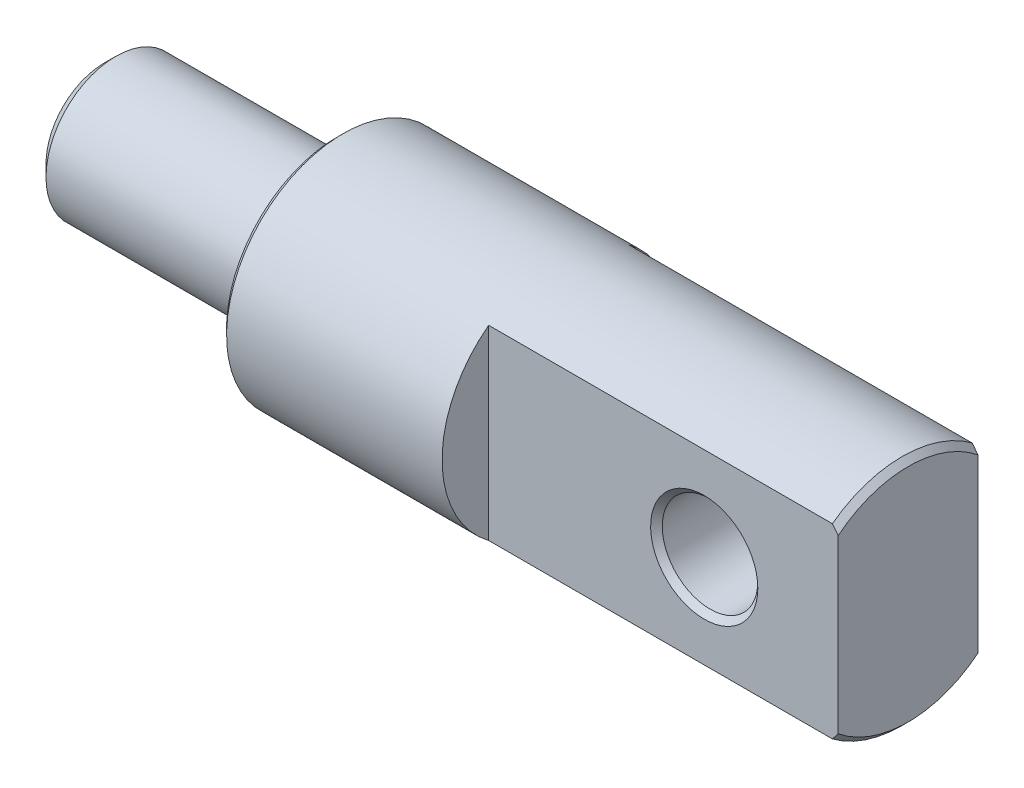
ISO-10303-21;
HEADER;
FILE_DESCRIPTION(('STEP AP214'),'2;1');
FILE_NAME('part.step','',(''),(''),'','','');
FILE_SCHEMA(('AUTOMOTIVE_DESIGN { 1 0 10303 214 1 1 1 1 }'));
ENDSEC;
DATA;
#1=APPLICATION_CONTEXT('core data for automotive mechanical design processes');
#2=APPLICATION_PROTOCOL_DEFINITION('international standard','automotive_design',2000,#1);
#3=PRODUCT_CONTEXT('',#1,'mechanical');
#4=PRODUCT('Part','Part','',(#3));
#5=PRODUCT_RELATED_PRODUCT_CATEGORY('part','',(#4));
#6=PRODUCT_DEFINITION_FORMATION('','',#4);
#7=PRODUCT_DEFINITION_CONTEXT('part definition',#1,'design');
#8=PRODUCT_DEFINITION('design','',#6,#7);
#9=PRODUCT_DEFINITION_SHAPE('','',#8);
#10=(LENGTH_UNIT() NAMED_UNIT(*) SI_UNIT(.MILLI.,.METRE.));
#11=(NAMED_UNIT(*) PLANE_ANGLE_UNIT() SI_UNIT($,.RADIAN.));
#12=(NAMED_UNIT(*) SI_UNIT($,.STERADIAN.) SOLID_ANGLE_UNIT());
#13=UNCERTAINTY_MEASURE_WITH_UNIT(LENGTH_MEASURE(1.E-05),#10,'distance_accuracy_value','');
#14=(GEOMETRIC_REPRESENTATION_CONTEXT(3) GLOBAL_UNCERTAINTY_ASSIGNED_CONTEXT((#13)) GLOBAL_UNIT_ASSIGNED_CONTEXT((#10,
#11,#12)) REPRESENTATION_CONTEXT('',''));
#15=CARTESIAN_POINT('',(0.,0.,0.));
#16=DIRECTION('',(0.,0.,1.));
#17=DIRECTION('',(1.,0.,0.));
#18=AXIS2_PLACEMENT_3D('',#15,#16,#17);
#19=CARTESIAN_POINT('',(-0.499999999999994,0.,0.));
#20=DIRECTION('',(-1.,0.,0.));
#21=DIRECTION('',(0.,0.,1.));
#22=AXIS2_PLACEMENT_3D('',#19,#20,#21);
#23=CONICAL_SURFACE('',#22,10.,0.785398163397447);
#24=CARTESIAN_POINT('',(-12.5039494142455,21.1701154891671,-6.));
#25=CARTESIAN_POINT('',(-12.091190365847,20.7410798294589,-6.));
#26=CARTESIAN_POINT('',(-11.6788968606787,20.3115950192424,-6.));
#27=CARTESIAN_POINT('',(-10.8554743710338,19.4515033713583,-6.));
#28=CARTESIAN_POINT('',(-10.4443453969857,19.0208965237089,-6.));
#29=CARTESIAN_POINT('',(-9.62336194211401,18.1582072404821,-6.));
#30=CARTESIAN_POINT('',(-9.2135079093668,17.7261243782643,-6.));
#31=CARTESIAN_POINT('',(-8.39553655712459,16.8603200291922,-6.));
#32=CARTESIAN_POINT('',(-7.98741923114935,16.4265985484637,-6.));
#33=CARTESIAN_POINT('',(-7.17633451033705,15.5603061278133,-6.));
#34=CARTESIAN_POINT('',(-6.77335128776228,15.127750017435,-6.));
#35=CARTESIAN_POINT('',(-5.97010411156479,14.2601209617599,-6.));
#36=CARTESIAN_POINT('',(-5.56984014626431,13.8250480272863,-6.));
#37=CARTESIAN_POINT('',(-4.77289483196968,12.9517347517868,-6.));
#38=CARTESIAN_POINT('',(-4.37621301722734,12.5134948362666,-6.));
#39=CARTESIAN_POINT('',(-3.58754545885852,11.6328148436562,-6.));
#40=CARTESIAN_POINT('',(-3.19555961370525,11.1903748577435,-6.));
#41=CARTESIAN_POINT('',(-2.52798578717093,10.4257658260493,-6.));
#42=CARTESIAN_POINT('',(-2.25082914669205,10.1049677540448,-6.));
#43=CARTESIAN_POINT('',(-1.70077429329717,9.45969683514604,-6.));
#44=CARTESIAN_POINT('',(-1.42787634977637,9.13522375800219,-6.));
#45=CARTESIAN_POINT('',(-0.886435619918574,8.48010750822695,-6.));
#46=CARTESIAN_POINT('',(-0.617919020967711,8.14944264449793,-6.));
#47=CARTESIAN_POINT('',(-0.0885405137306227,7.4820815089113,-6.));
#48=CARTESIAN_POINT('',(0.172322570913099,7.14538617689435,-6.));
#49=CARTESIAN_POINT('',(0.556645957484463,6.63297662670291,-6.));
#50=CARTESIAN_POINT('',(0.684083536426392,6.4602453788909,-6.));
#51=CARTESIAN_POINT('',(0.935695812977345,6.11242616941712,-6.));
#52=CARTESIAN_POINT('',(1.05987063360173,5.93733829698436,-6.));
#53=CARTESIAN_POINT('',(1.3043942970045,5.58427970421674,-6.));
#54=CARTESIAN_POINT('',(1.42473974081136,5.40630662340097,-6.));
#55=CARTESIAN_POINT('',(1.66062192522121,5.04719581841993,-6.));
#56=CARTESIAN_POINT('',(1.77615876899503,4.86605816227067,-6.));
#57=CARTESIAN_POINT('',(2.00087763108439,4.50083145164879,-6.));
#58=CARTESIAN_POINT('',(2.11008249541807,4.31675651859897,-6.));
#59=CARTESIAN_POINT('',(2.32121427590931,3.94442461780801,-6.));
#60=CARTESIAN_POINT('',(2.42314029636469,3.75616713910571,-6.));
#61=CARTESIAN_POINT('',(2.61774281634996,3.37523835560987,-6.));
#62=CARTESIAN_POINT('',(2.71043249905714,3.18257383873923,-6.));
#63=CARTESIAN_POINT('',(2.88441890461401,2.79220723693701,-6.));
#64=CARTESIAN_POINT('',(2.9657200378082,2.59450713734115,-6.));
#65=CARTESIAN_POINT('',(3.11560055003229,2.19008153634465,-6.));
#66=CARTESIAN_POINT('',(3.18391526658625,1.98325656825776,-6.));
#67=CARTESIAN_POINT('',(3.30263551502802,1.56447670305726,-6.));
#68=CARTESIAN_POINT('',(3.35304391038792,1.3525226319548,-6.));
#69=CARTESIAN_POINT('',(3.43252144617962,0.926164904619122,-6.));
#70=CARTESIAN_POINT('',(3.46174301381399,0.711790247191936,-6.));
#71=CARTESIAN_POINT('',(3.49724782214167,0.281135582464939,-6.));
#72=CARTESIAN_POINT('',(3.50353426941779,0.064855845754998,-6.));
#73=CARTESIAN_POINT('',(3.49264454748877,-0.367714626053586,-6.));
#74=CARTESIAN_POINT('',(3.47540156883901,-0.584003641484009,-6.));
#75=CARTESIAN_POINT('',(3.41871408384063,-1.01363081578645,-6.));
#76=CARTESIAN_POINT('',(3.37926493878841,-1.22696834857251,-6.));
#77=CARTESIAN_POINT('',(3.28051855064258,-1.65069513567977,-6.));
#78=CARTESIAN_POINT('',(3.22106654901841,-1.8610476458576,-6.));
#79=CARTESIAN_POINT('',(3.08571610576618,-2.27631462913761,-6.));
#80=CARTESIAN_POINT('',(3.00981681372029,-2.48122882043279,-6.));
#81=CARTESIAN_POINT('',(2.82936136375063,-2.92325359049391,-6.));
#82=CARTESIAN_POINT('',(2.72210071483705,-3.15924955537198,-6.));
#83=CARTESIAN_POINT('',(2.49327054486448,-3.62425908965807,-6.));
#84=CARTESIAN_POINT('',(2.37169298791231,-3.85326864602353,-6.));
#85=CARTESIAN_POINT('',(2.11739341373863,-4.30556788571122,-6.));
#86=CARTESIAN_POINT('',(1.98464952788855,-4.52884517213356,-6.));
#87=CARTESIAN_POINT('',(1.71077662824844,-4.97010111432998,-6.));
#88=CARTESIAN_POINT('',(1.56964922410078,-5.18808077599959,-6.));
#89=CARTESIAN_POINT('',(1.27927805801862,-5.62196791451213,-6.));
#90=CARTESIAN_POINT('',(1.12996300177842,-5.83782745434849,-6.));
#91=CARTESIAN_POINT('',(0.826047803473616,-6.26579050362456,-6.));
#92=CARTESIAN_POINT('',(0.671447474968389,-6.47789388016227,-6.));
#93=CARTESIAN_POINT('',(0.358225638411608,-6.89867699809957,-6.));
#94=CARTESIAN_POINT('',(0.199609570985605,-7.10736080044577,-6.));
#95=CARTESIAN_POINT('',(-0.12103675251668,-7.52207550413621,-6.));
#96=CARTESIAN_POINT('',(-0.283066938100282,-7.72810646011362,-6.));
#97=CARTESIAN_POINT('',(-0.687168412794741,-8.23478049054392,-6.));
#98=CARTESIAN_POINT('',(-0.93087582518826,-8.53411770246222,-6.));
#99=CARTESIAN_POINT('',(-1.4229207494858,-9.12896889507986,-6.));
#100=CARTESIAN_POINT('',(-1.67125844952637,-9.4244827195984,-6.));
#101=CARTESIAN_POINT('',(-2.17157845392902,-10.0124717176516,-6.));
#102=CARTESIAN_POINT('',(-2.42356123746384,-10.3049464828347,-6.));
#103=CARTESIAN_POINT('',(-2.93040067395281,-10.8873979080798,-6.));
#104=CARTESIAN_POINT('',(-3.18525736345251,-11.1773745362917,-6.));
#105=CARTESIAN_POINT('',(-3.69757418996066,-11.7555923289856,-6.));
#106=CARTESIAN_POINT('',(-3.9550369058519,-12.0438312062426,-6.));
#107=CARTESIAN_POINT('',(-4.47187020755025,-12.6185943396549,-6.));
#108=CARTESIAN_POINT('',(-4.73124080308913,-12.9051185870507,-6.));
#109=CARTESIAN_POINT('',(-5.5116633750808,-13.7624968960908,-6.));
#110=CARTESIAN_POINT('',(-6.03507086463796,-14.3312067610223,-6.));
#111=CARTESIAN_POINT('',(-7.05088012078864,-15.4262879079344,-6.));
#112=CARTESIAN_POINT('',(-7.54299267901504,-15.9529281874446,-6.));
#113=CARTESIAN_POINT('',(-8.53014443431241,-17.0034816136318,-6.));
#114=CARTESIAN_POINT('',(-9.02518370281447,-17.5273946931553,-6.));
#115=CARTESIAN_POINT('',(-10.0165236482941,-18.572072034514,-6.));
#116=CARTESIAN_POINT('',(-10.5128199444807,-19.0928404576516,-6.));
#117=CARTESIAN_POINT('',(-11.5071723775412,-20.1326585214098,-6.));
#118=CARTESIAN_POINT('',(-12.0052284494463,-20.6517082241409,-6.));
#119=CARTESIAN_POINT('',(-12.5039494142455,-21.1701154891671,-6.));
#120=B_SPLINE_CURVE_WITH_KNOTS('',3,(#24,#25,#26,#27,#28,#29,#30,#31,#32,#33,#34,#35,#36,#37,
#38,#39,#40,#41,#42,#43,#44,#45,#46,#47,#48,#49,#50,#51,#52,#53,#54,#55,#56,#57,#58,#59,#60,#61,
#62,#63,#64,#65,#66,#67,#68,#69,#70,#71,#72,#73,#74,#75,#76,#77,#78,#79,#80,#81,#82,#83,#84,#85,
#86,#87,#88,#89,#90,#91,#92,#93,#94,#95,#96,#97,#98,#99,#100,#101,#102,#103,#104,#105,#106,#107,
#108,#109,#110,#111,#112,#113,#114,#115,#116,#117,#118,#119),.UNSPECIFIED.,.F.,.F.,(4,2,2,2,2,2,
2,2,2,2,2,2,2,2,2,2,2,2,2,2,2,2,2,2,2,2,2,2,2,2,2,2,2,2,2,2,2,2,2,2,2,2,2,2,2,2,2,4),(0.,
1.78605103355112,3.57211801106311,5.35875436760017,7.14538405174456,8.91893159898234,
10.6924715249716,12.4657774370266,14.2390449407946,15.5108448631283,16.7827249130763,
18.0605256932281,19.3381290333558,19.9820620585823,20.6259707707449,21.2704359205352,
21.9148872358783,22.5568465039908,23.1988846331175,23.8399928343649,24.4808520687409,
25.1336276587972,25.7862988138318,26.434226473307,27.0820635418764,27.7317439114176,
28.3815600447627,29.0365239420978,29.6915217128501,30.4685559906934,31.2460285053799,
32.025060781223,32.8039439626689,33.5912542660151,34.3785923708414,35.1649155160774,
35.9512224416591,37.1091567026039,38.2671381153823,39.4252731621318,40.5834229527557,
41.7428600320195,42.9023030294748,45.22098724893,47.3833171712582,49.5457000884201,
51.703840220229,53.8619014915945),.UNSPECIFIED.);
#121=CARTESIAN_POINT('',(-0.499999999999993,8.,-6.));
#122=VERTEX_POINT('',#121);
#123=CARTESIAN_POINT('',(0.,7.36545993132813,-6.));
#124=VERTEX_POINT('',#123);
#125=EDGE_CURVE('E87',#122,#124,#120,.T.);
#126=ORIENTED_EDGE('',*,*,#125,.F.);
#127=CARTESIAN_POINT('',(-0.499999999999994,0.,0.));
#128=DIRECTION('',(-1.,0.,0.));
#129=DIRECTION('',(0.,0.,1.));
#130=AXIS2_PLACEMENT_3D('',#127,#128,#129);
#131=CIRCLE('',#130,10.);
#132=CARTESIAN_POINT('',(-0.499999999999993,8.,6.));
#133=VERTEX_POINT('',#132);
#134=EDGE_CURVE('E110',#133,#122,#131,.T.);
#135=ORIENTED_EDGE('',*,*,#134,.F.);
#136=CARTESIAN_POINT('',(-12.5039494142455,-21.1701154891671,6.));
#137=CARTESIAN_POINT('',(-12.091190365847,-20.7410798294589,6.));
#138=CARTESIAN_POINT('',(-11.6788968606787,-20.3115950192424,6.));
#139=CARTESIAN_POINT('',(-10.8554743710338,-19.4515033713583,6.));
#140=CARTESIAN_POINT('',(-10.4443453969857,-19.0208965237089,6.));
#141=CARTESIAN_POINT('',(-9.62336194211401,-18.1582072404821,6.));
#142=CARTESIAN_POINT('',(-9.21350790936681,-17.7261243782643,6.));
#143=CARTESIAN_POINT('',(-8.39553655712459,-16.8603200291922,6.));
#144=CARTESIAN_POINT('',(-7.98741923114935,-16.4265985484637,6.));
#145=CARTESIAN_POINT('',(-7.17633451033705,-15.5603061278133,6.));
#146=CARTESIAN_POINT('',(-6.77335128776228,-15.127750017435,6.));
#147=CARTESIAN_POINT('',(-5.97010411156478,-14.2601209617599,6.));
#148=CARTESIAN_POINT('',(-5.56984014626431,-13.8250480272863,6.));
#149=CARTESIAN_POINT('',(-4.77289483196968,-12.9517347517868,6.));
#150=CARTESIAN_POINT('',(-4.37621301722734,-12.5134948362666,6.));
#151=CARTESIAN_POINT('',(-3.58754545885852,-11.6328148436562,6.));
#152=CARTESIAN_POINT('',(-3.19555961370525,-11.1903748577435,6.));
#153=CARTESIAN_POINT('',(-2.52798578717094,-10.4257658260493,6.));
#154=CARTESIAN_POINT('',(-2.25082914669206,-10.1049677540448,6.));
#155=CARTESIAN_POINT('',(-1.70077429329717,-9.45969683514605,6.));
#156=CARTESIAN_POINT('',(-1.42787634977637,-9.13522375800219,6.));
#157=CARTESIAN_POINT('',(-0.886435619918575,-8.48010750822695,6.));
#158=CARTESIAN_POINT('',(-0.617919020967711,-8.14944264449793,6.));
#159=CARTESIAN_POINT('',(-0.0885405137306242,-7.4820815089113,6.));
#160=CARTESIAN_POINT('',(0.172322570913097,-7.14538617689435,6.));
#161=CARTESIAN_POINT('',(0.556645957484462,-6.63297662670291,6.));
#162=CARTESIAN_POINT('',(0.684083536426392,-6.4602453788909,6.));
#163=CARTESIAN_POINT('',(0.935695812977346,-6.11242616941712,6.));
#164=CARTESIAN_POINT('',(1.05987063360173,-5.93733829698436,6.));
#165=CARTESIAN_POINT('',(1.3043942970045,-5.58427970421674,6.));
#166=CARTESIAN_POINT('',(1.42473974081136,-5.40630662340097,6.));
#167=CARTESIAN_POINT('',(1.66062192522121,-5.04719581841993,6.));
#168=CARTESIAN_POINT('',(1.77615876899503,-4.86605816227067,6.));
#169=CARTESIAN_POINT('',(2.00087763108439,-4.50083145164879,6.));
#170=CARTESIAN_POINT('',(2.11008249541807,-4.31675651859897,6.));
#171=CARTESIAN_POINT('',(2.32121427590931,-3.94442461780801,6.));
#172=CARTESIAN_POINT('',(2.42314029636469,-3.75616713910571,6.));
#173=CARTESIAN_POINT('',(2.61774281634997,-3.37523835560987,6.));
#174=CARTESIAN_POINT('',(2.71043249905714,-3.18257383873923,6.));
#175=CARTESIAN_POINT('',(2.88441890461401,-2.792207236937,6.));
#176=CARTESIAN_POINT('',(2.9657200378082,-2.59450713734115,6.));
#177=CARTESIAN_POINT('',(3.11560055003229,-2.19008153634465,6.));
#178=CARTESIAN_POINT('',(3.18391526658625,-1.98325656825776,6.));
#179=CARTESIAN_POINT('',(3.30263551502802,-1.56447670305726,6.));
#180=CARTESIAN_POINT('',(3.35304391038792,-1.3525226319548,6.));
#181=CARTESIAN_POINT('',(3.43252144617962,-0.926164904619119,6.));
#182=CARTESIAN_POINT('',(3.46174301381399,-0.711790247191932,6.));
#183=CARTESIAN_POINT('',(3.49724782214167,-0.281135582464935,6.));
#184=CARTESIAN_POINT('',(3.50353426941779,-0.0648558457549947,6.));
#185=CARTESIAN_POINT('',(3.49264454748876,0.36771462605359,6.));
#186=CARTESIAN_POINT('',(3.47540156883901,0.584003641484014,6.));
#187=CARTESIAN_POINT('',(3.41871408384063,1.01363081578645,6.));
#188=CARTESIAN_POINT('',(3.37926493878841,1.22696834857251,6.));
#189=CARTESIAN_POINT('',(3.28051855064257,1.65069513567978,6.));
#190=CARTESIAN_POINT('',(3.22106654901841,1.86104764585761,6.));
#191=CARTESIAN_POINT('',(3.08571610576618,2.27631462913762,6.));
#192=CARTESIAN_POINT('',(3.00981681372029,2.4812288204328,6.));
#193=CARTESIAN_POINT('',(2.82936136375063,2.92325359049391,6.));
#194=CARTESIAN_POINT('',(2.72210071483704,3.15924955537198,6.));
#195=CARTESIAN_POINT('',(2.49327054486448,3.62425908965807,6.));
#196=CARTESIAN_POINT('',(2.37169298791231,3.85326864602353,6.));
#197=CARTESIAN_POINT('',(2.11739341373863,4.30556788571122,6.));
#198=CARTESIAN_POINT('',(1.98464952788854,4.52884517213357,6.));
#199=CARTESIAN_POINT('',(1.71077662824844,4.97010111432999,6.));
#200=CARTESIAN_POINT('',(1.56964922410077,5.1880807759996,6.));
#201=CARTESIAN_POINT('',(1.27927805801862,5.62196791451214,6.));
#202=CARTESIAN_POINT('',(1.12996300177842,5.83782745434849,6.));
#203=CARTESIAN_POINT('',(0.826047803473614,6.26579050362456,6.));
#204=CARTESIAN_POINT('',(0.671447474968386,6.47789388016228,6.));
#205=CARTESIAN_POINT('',(0.358225638411602,6.89867699809958,6.));
#206=CARTESIAN_POINT('',(0.199609570985599,7.10736080044577,6.));
#207=CARTESIAN_POINT('',(-0.121036752516689,7.52207550413622,6.));
#208=CARTESIAN_POINT('',(-0.283066938100291,7.72810646011363,6.));
#209=CARTESIAN_POINT('',(-0.687168412794751,8.23478049054393,6.));
#210=CARTESIAN_POINT('',(-0.930875825188269,8.53411770246223,6.));
#211=CARTESIAN_POINT('',(-1.42292074948581,9.12896889507987,6.));
#212=CARTESIAN_POINT('',(-1.67125844952638,9.42448271959841,6.));
#213=CARTESIAN_POINT('',(-2.17157845392903,10.0124717176516,6.));
#214=CARTESIAN_POINT('',(-2.42356123746385,10.3049464828347,6.));
#215=CARTESIAN_POINT('',(-2.93040067395282,10.8873979080798,6.));
#216=CARTESIAN_POINT('',(-3.18525736345251,11.1773745362918,6.));
#217=CARTESIAN_POINT('',(-3.69757418996066,11.7555923289856,6.));
#218=CARTESIAN_POINT('',(-3.9550369058519,12.0438312062426,6.));
#219=CARTESIAN_POINT('',(-4.47187020755026,12.6185943396549,6.));
#220=CARTESIAN_POINT('',(-4.73124080308914,12.9051185870507,6.));
#221=CARTESIAN_POINT('',(-5.51166337508081,13.7624968960908,6.));
#222=CARTESIAN_POINT('',(-6.03507086463797,14.3312067610223,6.));
#223=CARTESIAN_POINT('',(-7.05088012078864,15.4262879079344,6.));
#224=CARTESIAN_POINT('',(-7.54299267901504,15.9529281874446,6.));
#225=CARTESIAN_POINT('',(-8.53014443431242,17.0034816136318,6.));
#226=CARTESIAN_POINT('',(-9.02518370281448,17.5273946931553,6.));
#227=CARTESIAN_POINT('',(-10.0165236482941,18.5720720345141,6.));
#228=CARTESIAN_POINT('',(-10.5128199444807,19.0928404576516,6.));
#229=CARTESIAN_POINT('',(-11.5071723775412,20.1326585214098,6.));
#230=CARTESIAN_POINT('',(-12.0052284494463,20.6517082241409,6.));
#231=CARTESIAN_POINT('',(-12.5039494142455,21.1701154891671,6.));
#232=B_SPLINE_CURVE_WITH_KNOTS('',3,(#136,#137,#138,#139,#140,#141,#142,#143,#144,#145,#146,
#147,#148,#149,#150,#151,#152,#153,#154,#155,#156,#157,#158,#159,#160,#161,#162,#163,#164,#165,
#166,#167,#168,#169,#170,#171,#172,#173,#174,#175,#176,#177,#178,#179,#180,#181,#182,#183,#184,
#185,#186,#187,#188,#189,#190,#191,#192,#193,#194,#195,#196,#197,#198,#199,#200,#201,#202,#203,
#204,#205,#206,#207,#208,#209,#210,#211,#212,#213,#214,#215,#216,#217,#218,#219,#220,#221,#222,
#223,#224,#225,#226,#227,#228,#229,#230,#231),.UNSPECIFIED.,.F.,.F.,(4,2,2,2,2,2,2,2,2,2,2,2,2,
2,2,2,2,2,2,2,2,2,2,2,2,2,2,2,2,2,2,2,2,2,2,2,2,2,2,2,2,2,2,2,2,2,2,4),(0.,1.78605103355111,
3.57211801106311,5.35875436760017,7.14538405174457,8.91893159898235,10.6924715249717,
12.4657774370266,14.2390449407946,15.5108448631283,16.7827249130763,18.0605256932281,
19.3381290333558,19.9820620585823,20.6259707707449,21.2704359205352,21.9148872358784,
22.5568465039908,23.1988846331175,23.8399928343649,24.4808520687409,25.1336276587972,
25.7862988138318,26.434226473307,27.0820635418764,27.7317439114176,28.3815600447627,
29.0365239420978,29.6915217128501,30.4685559906934,31.2460285053799,32.025060781223,
32.8039439626689,33.5912542660151,34.3785923708414,35.1649155160774,35.9512224416591,
37.1091567026039,38.2671381153823,39.4252731621318,40.5834229527557,41.7428600320195,
42.9023030294748,45.22098724893,47.3833171712582,49.5457000884201,51.703840220229,
53.8619014915945),.UNSPECIFIED.);
#233=CARTESIAN_POINT('',(0.,7.36545993132813,6.));
#234=VERTEX_POINT('',#233);
#235=EDGE_CURVE('E105',#234,#133,#232,.T.);
#236=ORIENTED_EDGE('',*,*,#235,.F.);
#237=CARTESIAN_POINT('',(0.,0.,0.));
#238=DIRECTION('',(-1.,0.,0.));
#239=DIRECTION('',(0.,0.,1.));
#240=AXIS2_PLACEMENT_3D('',#237,#238,#239);
#241=CIRCLE('',#240,9.50000000000001);
#242=EDGE_CURVE('E57',#124,#234,#241,.F.);
#243=ORIENTED_EDGE('',*,*,#242,.F.);
#244=EDGE_LOOP('',(#126,#135,#236,#243));
#245=FACE_BOUND('',#244,.T.);
#246=ADVANCED_FACE('F35',(#245),#23,.T.);
#247=CARTESIAN_POINT('',(0.,10.,0.));
#248=DIRECTION('',(-1.,0.,0.));
#249=DIRECTION('',(0.,0.,1.));
#250=AXIS2_PLACEMENT_3D('',#247,#248,#249);
#251=PLANE('',#250);
#252=CARTESIAN_POINT('',(0.,-7.36545993132813,6.));
#253=VERTEX_POINT('',#252);
#254=CARTESIAN_POINT('',(0.,-7.36545993132813,-6.));
#255=VERTEX_POINT('',#254);
#256=EDGE_CURVE('E101',#253,#255,#241,.F.);
#257=ORIENTED_EDGE('',*,*,#256,.T.);
#258=DIRECTION('',(0.,-1.,0.));
#259=VECTOR('',#258,1.);
#260=CARTESIAN_POINT('',(0.,15.,-6.));
#261=LINE('',#260,#259);
#262=EDGE_CURVE('E50',#124,#255,#261,.T.);
#263=ORIENTED_EDGE('',*,*,#262,.F.);
#264=ORIENTED_EDGE('',*,*,#242,.T.);
#265=DIRECTION('',(0.,1.,0.));
#266=VECTOR('',#265,1.);
#267=CARTESIAN_POINT('',(0.,15.,6.));
#268=LINE('',#267,#266);
#269=EDGE_CURVE('E310',#253,#234,#268,.T.);
#270=ORIENTED_EDGE('',*,*,#269,.F.);
#271=EDGE_LOOP('',(#257,#263,#264,#270));
#272=FACE_BOUND('',#271,.T.);
#273=ADVANCED_FACE('F99',(#272),#251,.F.);
#274=CARTESIAN_POINT('',(0.,0.,0.));
#275=DIRECTION('',(-1.,0.,0.));
#276=DIRECTION('',(0.,0.,1.));
#277=AXIS2_PLACEMENT_3D('',#274,#275,#276);
#278=CYLINDRICAL_SURFACE('',#277,10.);
#279=ORIENTED_EDGE('',*,*,#134,.T.);
#280=DIRECTION('',(-1.,0.,0.));
#281=VECTOR('',#280,1.);
#282=CARTESIAN_POINT('',(0.,8.,-6.));
#283=LINE('',#282,#281);
#284=CARTESIAN_POINT('',(-30.,8.,-6.));
#285=VERTEX_POINT('',#284);
#286=EDGE_CURVE('E91',#122,#285,#283,.T.);
#287=ORIENTED_EDGE('',*,*,#286,.T.);
#288=CARTESIAN_POINT('',(-30.,0.,0.));
#289=DIRECTION('',(1.,0.,0.));
#290=DIRECTION('',(0.,0.,-1.));
#291=AXIS2_PLACEMENT_3D('',#288,#289,#290);
#292=CIRCLE('',#291,10.);
#293=CARTESIAN_POINT('',(-30.,-8.,-6.));
#294=VERTEX_POINT('',#293);
#295=EDGE_CURVE('E95',#294,#285,#292,.T.);
#296=ORIENTED_EDGE('',*,*,#295,.F.);
#297=DIRECTION('',(-1.,0.,0.));
#298=VECTOR('',#297,1.);
#299=CARTESIAN_POINT('',(0.,-8.,-6.));
#300=LINE('',#299,#298);
#301=CARTESIAN_POINT('',(-0.499999999999993,-8.,-6.));
#302=VERTEX_POINT('',#301);
#303=EDGE_CURVE('E336',#294,#302,#300,.F.);
#304=ORIENTED_EDGE('',*,*,#303,.T.);
#305=CARTESIAN_POINT('',(-0.499999999999993,-8.,6.));
#306=VERTEX_POINT('',#305);
#307=EDGE_CURVE('E316',#302,#306,#131,.T.);
#308=ORIENTED_EDGE('',*,*,#307,.T.);
#309=DIRECTION('',(-1.,0.,0.));
#310=VECTOR('',#309,1.);
#311=CARTESIAN_POINT('',(0.,-8.,6.));
#312=LINE('',#311,#310);
#313=CARTESIAN_POINT('',(-30.,-8.,6.));
#314=VERTEX_POINT('',#313);
#315=EDGE_CURVE('E312',#306,#314,#312,.T.);
#316=ORIENTED_EDGE('',*,*,#315,.T.);
#317=CARTESIAN_POINT('',(-30.,0.,0.));
#318=DIRECTION('',(1.,0.,0.));
#319=DIRECTION('',(0.,0.,-1.));
#320=AXIS2_PLACEMENT_3D('',#317,#318,#319);
#321=CIRCLE('',#320,10.);
#322=CARTESIAN_POINT('',(-30.,8.,6.));
#323=VERTEX_POINT('',#322);
#324=EDGE_CURVE('E126',#323,#314,#321,.T.);
#325=ORIENTED_EDGE('',*,*,#324,.F.);
#326=DIRECTION('',(-1.,0.,0.));
#327=VECTOR('',#326,1.);
#328=CARTESIAN_POINT('',(0.,8.,6.));
#329=LINE('',#328,#327);
#330=EDGE_CURVE('E331',#323,#133,#329,.F.);
#331=ORIENTED_EDGE('',*,*,#330,.T.);
#332=EDGE_LOOP('',(#279,#287,#296,#304,#308,#316,#325,#331));
#333=FACE_BOUND('',#332,.T.);
#334=CARTESIAN_POINT('',(-48.5,0.,0.));
#335=DIRECTION('',(1.,0.,0.));
#336=DIRECTION('',(0.,0.,-1.));
#337=AXIS2_PLACEMENT_3D('',#334,#335,#336);
#338=CIRCLE('',#337,10.);
#339=CARTESIAN_POINT('',(-48.5,0.,-10.));
#340=VERTEX_POINT('',#339);
#341=EDGE_CURVE('E106',#340,#340,#338,.T.);
#342=ORIENTED_EDGE('',*,*,#341,.T.);
#343=EDGE_LOOP('',(#342));
#344=FACE_BOUND('',#343,.T.);
#345=ADVANCED_FACE('F160',(#333,#344),#278,.T.);
#346=CARTESIAN_POINT('',(-49.,4.99999999999999,0.));
#347=DIRECTION('',(1.,0.,0.));
#348=DIRECTION('',(0.,0.,-1.));
#349=AXIS2_PLACEMENT_3D('',#346,#347,#348);
#350=PLANE('',#349);
#351=CARTESIAN_POINT('',(-49.,0.,0.));
#352=DIRECTION('',(1.,0.,0.));
#353=DIRECTION('',(0.,0.,-1.));
#354=AXIS2_PLACEMENT_3D('',#351,#352,#353);
#355=CIRCLE('',#354,9.5);
#356=CARTESIAN_POINT('',(-49.,0.,-9.5));
#357=VERTEX_POINT('',#356);
#358=EDGE_CURVE('E317',#357,#357,#355,.F.);
#359=ORIENTED_EDGE('',*,*,#358,.T.);
#360=EDGE_LOOP('',(#359));
#361=FACE_BOUND('',#360,.T.);
#362=CARTESIAN_POINT('',(-49.,0.,0.));
#363=DIRECTION('',(-1.,0.,0.));
#364=DIRECTION('',(0.,0.,1.));
#365=AXIS2_PLACEMENT_3D('',#362,#363,#364);
#366=CIRCLE('',#365,4.99999999999999);
#367=CARTESIAN_POINT('',(-49.,0.,4.99999999999999));
#368=VERTEX_POINT('',#367);
#369=EDGE_CURVE('E319',#368,#368,#366,.T.);
#370=ORIENTED_EDGE('',*,*,#369,.F.);
#371=EDGE_LOOP('',(#370));
#372=FACE_BOUND('',#371,.T.);
#373=ADVANCED_FACE('F156',(#361,#372),#350,.F.);
#374=CARTESIAN_POINT('',(0.,0.,0.));
#375=DIRECTION('',(-1.,0.,0.));
#376=DIRECTION('',(0.,0.,1.));
#377=AXIS2_PLACEMENT_3D('',#374,#375,#376);
#378=CYLINDRICAL_SURFACE('',#377,4.99999999999999);
#379=CARTESIAN_POINT('',(-50.,0.,0.));
#380=DIRECTION('',(-1.,0.,0.));
#381=DIRECTION('',(0.,0.,1.));
#382=AXIS2_PLACEMENT_3D('',#379,#380,#381);
#383=CIRCLE('',#382,4.99999999999999);
#384=CARTESIAN_POINT('',(-50.,0.,4.99999999999999));
#385=VERTEX_POINT('',#384);
#386=EDGE_CURVE('E324',#385,#385,#383,.T.);
#387=ORIENTED_EDGE('',*,*,#386,.F.);
#388=EDGE_LOOP('',(#387));
#389=FACE_BOUND('',#388,.T.);
#390=ORIENTED_EDGE('',*,*,#369,.T.);
#391=EDGE_LOOP('',(#390));
#392=FACE_BOUND('',#391,.T.);
#393=ADVANCED_FACE('F152',(#389,#392),#378,.T.);
#394=CARTESIAN_POINT('',(-50.,6.,0.));
#395=DIRECTION('',(-1.,0.,0.));
#396=DIRECTION('',(0.,0.,1.));
#397=AXIS2_PLACEMENT_3D('',#394,#395,#396);
#398=PLANE('',#397);
#399=CARTESIAN_POINT('',(-50.,0.,0.));
#400=DIRECTION('',(-1.,0.,0.));
#401=DIRECTION('',(0.,0.,1.));
#402=AXIS2_PLACEMENT_3D('',#399,#400,#401);
#403=CIRCLE('',#402,6.);
#404=CARTESIAN_POINT('',(-50.,0.,6.));
#405=VERTEX_POINT('',#404);
#406=EDGE_CURVE('E327',#405,#405,#403,.T.);
#407=ORIENTED_EDGE('',*,*,#406,.F.);
#408=EDGE_LOOP('',(#407));
#409=FACE_BOUND('',#408,.T.);
#410=ORIENTED_EDGE('',*,*,#386,.T.);
#411=EDGE_LOOP('',(#410));
#412=FACE_BOUND('',#411,.T.);
#413=ADVANCED_FACE('F148',(#409,#412),#398,.F.);
#414=CARTESIAN_POINT('',(0.,0.,0.));
#415=DIRECTION('',(-1.,0.,0.));
#416=DIRECTION('',(0.,0.,1.));
#417=AXIS2_PLACEMENT_3D('',#414,#415,#416);
#418=CYLINDRICAL_SURFACE('',#417,6.);
#419=CARTESIAN_POINT('',(-68.,0.,0.));
#420=DIRECTION('',(1.,0.,0.));
#421=DIRECTION('',(0.,0.,-1.));
#422=AXIS2_PLACEMENT_3D('',#419,#420,#421);
#423=CIRCLE('',#422,6.);
#424=CARTESIAN_POINT('',(-68.,0.,-6.));
#425=VERTEX_POINT('',#424);
#426=EDGE_CURVE('E116',#425,#425,#423,.T.);
#427=ORIENTED_EDGE('',*,*,#426,.T.);
#428=EDGE_LOOP('',(#427));
#429=FACE_BOUND('',#428,.T.);
#430=ORIENTED_EDGE('',*,*,#406,.T.);
#431=EDGE_LOOP('',(#430));
#432=FACE_BOUND('',#431,.T.);
#433=ADVANCED_FACE('F144',(#429,#432),#418,.T.);
#434=CARTESIAN_POINT('',(-69.,6.,0.));
#435=DIRECTION('',(1.,0.,0.));
#436=DIRECTION('',(0.,0.,-1.));
#437=AXIS2_PLACEMENT_3D('',#434,#435,#436);
#438=PLANE('',#437);
#439=CARTESIAN_POINT('',(-69.,0.,0.));
#440=DIRECTION('',(1.,0.,0.));
#441=DIRECTION('',(0.,0.,-1.));
#442=AXIS2_PLACEMENT_3D('',#439,#440,#441);
#443=CIRCLE('',#442,5.);
#444=CARTESIAN_POINT('',(-69.,0.,-5.));
#445=VERTEX_POINT('',#444);
#446=EDGE_CURVE('E108',#445,#445,#443,.F.);
#447=ORIENTED_EDGE('',*,*,#446,.T.);
#448=EDGE_LOOP('',(#447));
#449=FACE_BOUND('',#448,.T.);
#450=ADVANCED_FACE('F140',(#449),#438,.F.);
#451=CARTESIAN_POINT('',(-49.,0.,0.));
#452=DIRECTION('',(1.,0.,0.));
#453=DIRECTION('',(0.,0.,-1.));
#454=AXIS2_PLACEMENT_3D('',#451,#452,#453);
#455=CONICAL_SURFACE('',#454,9.5,0.785398163397447);
#456=ORIENTED_EDGE('',*,*,#341,.F.);
#457=EDGE_LOOP('',(#456));
#458=FACE_BOUND('',#457,.T.);
#459=ORIENTED_EDGE('',*,*,#358,.F.);
#460=EDGE_LOOP('',(#459));
#461=FACE_BOUND('',#460,.T.);
#462=ADVANCED_FACE('F143',(#458,#461),#455,.T.);
#463=EDGE_CURVE('E96',#255,#302,#120,.T.);
#464=ORIENTED_EDGE('',*,*,#463,.F.);
#465=ORIENTED_EDGE('',*,*,#256,.F.);
#466=EDGE_CURVE('E125',#306,#253,#232,.T.);
#467=ORIENTED_EDGE('',*,*,#466,.F.);
#468=ORIENTED_EDGE('',*,*,#307,.F.);
#469=EDGE_LOOP('',(#464,#465,#467,#468));
#470=FACE_BOUND('',#469,.T.);
#471=ADVANCED_FACE('F127',(#470),#23,.T.);
#472=CARTESIAN_POINT('',(-69.,0.,0.));
#473=DIRECTION('',(1.,0.,0.));
#474=DIRECTION('',(0.,0.,-1.));
#475=AXIS2_PLACEMENT_3D('',#472,#473,#474);
#476=CONICAL_SURFACE('',#475,5.,0.785398163397441);
#477=ORIENTED_EDGE('',*,*,#426,.F.);
#478=EDGE_LOOP('',(#477));
#479=FACE_BOUND('',#478,.T.);
#480=ORIENTED_EDGE('',*,*,#446,.F.);
#481=EDGE_LOOP('',(#480));
#482=FACE_BOUND('',#481,.T.);
#483=ADVANCED_FACE('F171',(#479,#482),#476,.T.);
#484=CARTESIAN_POINT('',(-30.,0.,0.));
#485=DIRECTION('',(1.,0.,0.));
#486=DIRECTION('',(0.,0.,-1.));
#487=AXIS2_PLACEMENT_3D('',#484,#485,#486);
#488=PLANE('',#487);
#489=ORIENTED_EDGE('',*,*,#324,.T.);
#490=DIRECTION('',(0.,1.,0.));
#491=VECTOR('',#490,1.);
#492=CARTESIAN_POINT('',(-30.,15.,6.));
#493=LINE('',#492,#491);
#494=EDGE_CURVE('E314',#314,#323,#493,.T.);
#495=ORIENTED_EDGE('',*,*,#494,.T.);
#496=EDGE_LOOP('',(#489,#495));
#497=FACE_BOUND('',#496,.T.);
#498=ADVANCED_FACE('F137',(#497),#488,.T.);
#499=CARTESIAN_POINT('',(-30.,15.,6.));
#500=DIRECTION('',(0.,0.,-1.));
#501=DIRECTION('',(0.,1.,0.));
#502=AXIS2_PLACEMENT_3D('',#499,#500,#501);
#503=PLANE('',#502);
#504=CARTESIAN_POINT('',(-11.5,0.,6.));
#505=DIRECTION('',(0.,0.,-1.));
#506=DIRECTION('',(0.,1.,0.));
#507=AXIS2_PLACEMENT_3D('',#504,#505,#506);
#508=CIRCLE('',#507,4.6);
#509=CARTESIAN_POINT('',(-11.5,4.6,6.));
#510=VERTEX_POINT('',#509);
#511=EDGE_CURVE('E12',#510,#510,#508,.T.);
#512=ORIENTED_EDGE('',*,*,#511,.T.);
#513=EDGE_LOOP('',(#512));
#514=FACE_BOUND('',#513,.T.);
#515=ORIENTED_EDGE('',*,*,#466,.T.);
#516=ORIENTED_EDGE('',*,*,#269,.T.);
#517=ORIENTED_EDGE('',*,*,#235,.T.);
#518=ORIENTED_EDGE('',*,*,#330,.F.);
#519=ORIENTED_EDGE('',*,*,#494,.F.);
#520=ORIENTED_EDGE('',*,*,#315,.F.);
#521=EDGE_LOOP('',(#515,#516,#517,#518,#519,#520));
#522=FACE_BOUND('',#521,.T.);
#523=ADVANCED_FACE('F131',(#514,#522),#503,.F.);
#524=CARTESIAN_POINT('',(-30.,0.,0.));
#525=DIRECTION('',(1.,0.,0.));
#526=DIRECTION('',(0.,0.,-1.));
#527=AXIS2_PLACEMENT_3D('',#524,#525,#526);
#528=PLANE('',#527);
#529=ORIENTED_EDGE('',*,*,#295,.T.);
#530=DIRECTION('',(0.,-1.,0.));
#531=VECTOR('',#530,1.);
#532=CARTESIAN_POINT('',(-30.,15.,-6.));
#533=LINE('',#532,#531);
#534=EDGE_CURVE('E102',#285,#294,#533,.T.);
#535=ORIENTED_EDGE('',*,*,#534,.T.);
#536=EDGE_LOOP('',(#529,#535));
#537=FACE_BOUND('',#536,.T.);
#538=ADVANCED_FACE('F136',(#537),#528,.T.);
#539=CARTESIAN_POINT('',(-30.,15.,-6.));
#540=DIRECTION('',(0.,0.,1.));
#541=DIRECTION('',(0.,-1.,0.));
#542=AXIS2_PLACEMENT_3D('',#539,#540,#541);
#543=PLANE('',#542);
#544=CARTESIAN_POINT('',(-11.5,0.,-6.));
#545=DIRECTION('',(0.,0.,1.));
#546=DIRECTION('',(0.,-1.,0.));
#547=AXIS2_PLACEMENT_3D('',#544,#545,#546);
#548=CIRCLE('',#547,4.6);
#549=CARTESIAN_POINT('',(-11.5,-4.6,-6.));
#550=VERTEX_POINT('',#549);
#551=EDGE_CURVE('E43',#550,#550,#548,.T.);
#552=ORIENTED_EDGE('',*,*,#551,.T.);
#553=EDGE_LOOP('',(#552));
#554=FACE_BOUND('',#553,.T.);
#555=ORIENTED_EDGE('',*,*,#125,.T.);
#556=ORIENTED_EDGE('',*,*,#262,.T.);
#557=ORIENTED_EDGE('',*,*,#463,.T.);
#558=ORIENTED_EDGE('',*,*,#303,.F.);
#559=ORIENTED_EDGE('',*,*,#534,.F.);
#560=ORIENTED_EDGE('',*,*,#286,.F.);
#561=EDGE_LOOP('',(#555,#556,#557,#558,#559,#560));
#562=FACE_BOUND('',#561,.T.);
#563=ADVANCED_FACE('F88',(#554,#562),#543,.F.);
#564=CARTESIAN_POINT('',(-11.5,0.,-10.001));
#565=DIRECTION('',(0.,0.,1.));
#566=DIRECTION('',(1.,0.,0.));
#567=AXIS2_PLACEMENT_3D('',#564,#565,#566);
#568=CYLINDRICAL_SURFACE('',#567,4.1);
#569=CARTESIAN_POINT('',(-11.5,0.,-5.5));
#570=DIRECTION('',(0.,0.,1.));
#571=DIRECTION('',(1.,0.,0.));
#572=AXIS2_PLACEMENT_3D('',#569,#570,#571);
#573=CIRCLE('',#572,4.1);
#574=CARTESIAN_POINT('',(-7.4,0.,-5.5));
#575=VERTEX_POINT('',#574);
#576=EDGE_CURVE('E290',#575,#575,#573,.F.);
#577=ORIENTED_EDGE('',*,*,#576,.T.);
#578=EDGE_LOOP('',(#577));
#579=FACE_BOUND('',#578,.T.);
#580=CARTESIAN_POINT('',(-11.5,0.,5.5));
#581=DIRECTION('',(0.,0.,-1.));
#582=DIRECTION('',(-1.,0.,0.));
#583=AXIS2_PLACEMENT_3D('',#580,#581,#582);
#584=CIRCLE('',#583,4.1);
#585=CARTESIAN_POINT('',(-15.6,0.,5.5));
#586=VERTEX_POINT('',#585);
#587=EDGE_CURVE('E288',#586,#586,#584,.F.);
#588=ORIENTED_EDGE('',*,*,#587,.T.);
#589=EDGE_LOOP('',(#588));
#590=FACE_BOUND('',#589,.T.);
#591=ADVANCED_FACE('F245',(#579,#590),#568,.F.);
#592=CARTESIAN_POINT('',(-11.5,0.,-5.5));
#593=DIRECTION('',(0.,0.,-1.));
#594=DIRECTION('',(-1.,0.,0.));
#595=AXIS2_PLACEMENT_3D('',#592,#593,#594);
#596=CONICAL_SURFACE('',#595,4.1,0.785398163397448);
#597=ORIENTED_EDGE('',*,*,#551,.F.);
#598=EDGE_LOOP('',(#597));
#599=FACE_BOUND('',#598,.T.);
#600=ORIENTED_EDGE('',*,*,#576,.F.);
#601=EDGE_LOOP('',(#600));
#602=FACE_BOUND('',#601,.T.);
#603=ADVANCED_FACE('F252',(#599,#602),#596,.F.);
#604=CARTESIAN_POINT('',(-11.5,0.,5.5));
#605=DIRECTION('',(0.,0.,1.));
#606=DIRECTION('',(1.,0.,0.));
#607=AXIS2_PLACEMENT_3D('',#604,#605,#606);
#608=CONICAL_SURFACE('',#607,4.1,0.785398163397448);
#609=ORIENTED_EDGE('',*,*,#511,.F.);
#610=EDGE_LOOP('',(#609));
#611=FACE_BOUND('',#610,.T.);
#612=ORIENTED_EDGE('',*,*,#587,.F.);
#613=EDGE_LOOP('',(#612));
#614=FACE_BOUND('',#613,.T.);
#615=ADVANCED_FACE('F37',(#611,#614),#608,.F.);
#616=CLOSED_SHELL('',(#246,#273,#345,#373,#393,#413,#433,#450,#462,#471,#483,#498,#523,#538,
#563,#591,#603,#615));
#617=MANIFOLD_SOLID_BREP('B2',#616);
#618=ADVANCED_BREP_SHAPE_REPRESENTATION('',(#18,#617),#14);
#619=SHAPE_DEFINITION_REPRESENTATION(#9,#618);
ENDSEC;
END-ISO-10303-21;
